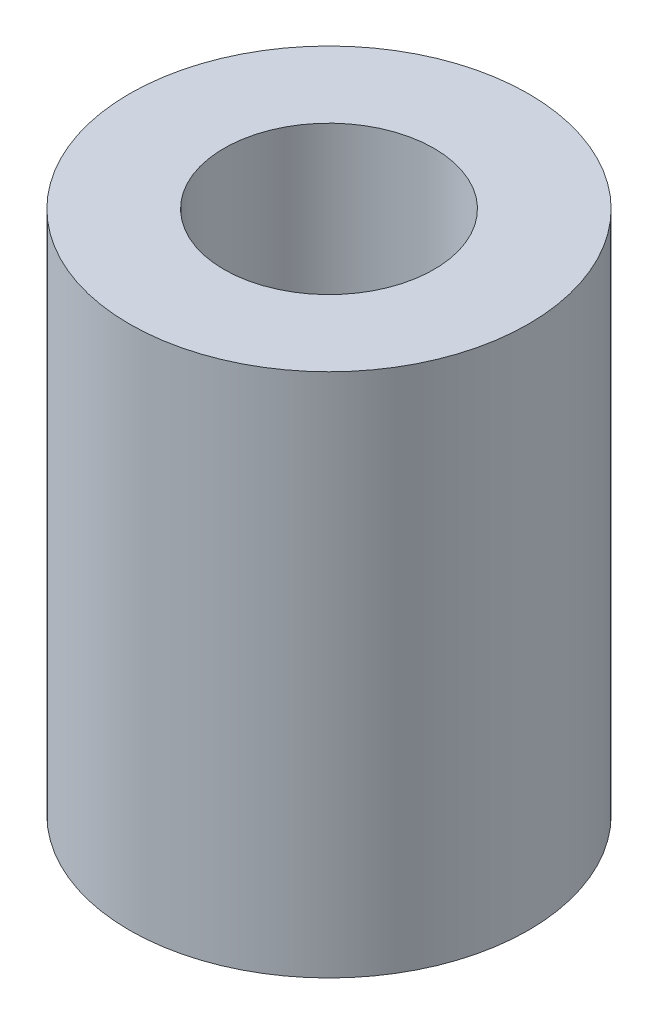
ISO-10303-21;
HEADER;
FILE_DESCRIPTION(('STEP AP214'),'2;1');
FILE_NAME('part.step','',(''),(''),'','','');
FILE_SCHEMA(('AUTOMOTIVE_DESIGN { 1 0 10303 214 1 1 1 1 }'));
ENDSEC;
DATA;
#1=APPLICATION_CONTEXT('core data for automotive mechanical design processes');
#2=APPLICATION_PROTOCOL_DEFINITION('international standard','automotive_design',2000,#1);
#3=PRODUCT_CONTEXT('',#1,'mechanical');
#4=PRODUCT('Part','Part','',(#3));
#5=PRODUCT_RELATED_PRODUCT_CATEGORY('part','',(#4));
#6=PRODUCT_DEFINITION_FORMATION('','',#4);
#7=PRODUCT_DEFINITION_CONTEXT('part definition',#1,'design');
#8=PRODUCT_DEFINITION('design','',#6,#7);
#9=PRODUCT_DEFINITION_SHAPE('','',#8);
#10=(LENGTH_UNIT() NAMED_UNIT(*) SI_UNIT(.MILLI.,.METRE.));
#11=(NAMED_UNIT(*) PLANE_ANGLE_UNIT() SI_UNIT($,.RADIAN.));
#12=(NAMED_UNIT(*) SI_UNIT($,.STERADIAN.) SOLID_ANGLE_UNIT());
#13=UNCERTAINTY_MEASURE_WITH_UNIT(LENGTH_MEASURE(1.E-05),#10,'distance_accuracy_value','');
#14=(GEOMETRIC_REPRESENTATION_CONTEXT(3) GLOBAL_UNCERTAINTY_ASSIGNED_CONTEXT((#13)) GLOBAL_UNIT_ASSIGNED_CONTEXT((#10,
#11,#12)) REPRESENTATION_CONTEXT('',''));
#15=CARTESIAN_POINT('',(0.,0.,0.));
#16=DIRECTION('',(0.,0.,1.));
#17=DIRECTION('',(1.,0.,0.));
#18=AXIS2_PLACEMENT_3D('',#15,#16,#17);
#19=CARTESIAN_POINT('',(0.,25.,0.));
#20=DIRECTION('',(0.,-1.,0.));
#21=DIRECTION('',(0.,0.,-1.));
#22=AXIS2_PLACEMENT_3D('',#19,#20,#21);
#23=CYLINDRICAL_SURFACE('',#22,9.5);
#24=CARTESIAN_POINT('',(0.,25.,0.));
#25=DIRECTION('',(0.,1.,0.));
#26=DIRECTION('',(0.,0.,1.));
#27=AXIS2_PLACEMENT_3D('',#24,#25,#26);
#28=CIRCLE('',#27,9.5);
#29=CARTESIAN_POINT('',(0.,25.,9.5));
#30=VERTEX_POINT('',#29);
#31=EDGE_CURVE('E10',#30,#30,#28,.T.);
#32=ORIENTED_EDGE('',*,*,#31,.F.);
#33=EDGE_LOOP('',(#32));
#34=FACE_BOUND('',#33,.T.);
#35=CARTESIAN_POINT('',(0.,0.,0.));
#36=DIRECTION('',(0.,1.,0.));
#37=DIRECTION('',(0.,0.,1.));
#38=AXIS2_PLACEMENT_3D('',#35,#36,#37);
#39=CIRCLE('',#38,9.5);
#40=CARTESIAN_POINT('',(0.,0.,9.5));
#41=VERTEX_POINT('',#40);
#42=EDGE_CURVE('E40',#41,#41,#39,.T.);
#43=ORIENTED_EDGE('',*,*,#42,.T.);
#44=EDGE_LOOP('',(#43));
#45=FACE_BOUND('',#44,.T.);
#46=ADVANCED_FACE('F37',(#34,#45),#23,.T.);
#47=CARTESIAN_POINT('',(0.,25.,0.));
#48=DIRECTION('',(0.,1.,0.));
#49=DIRECTION('',(0.,0.,1.));
#50=AXIS2_PLACEMENT_3D('',#47,#48,#49);
#51=PLANE('',#50);
#52=CARTESIAN_POINT('',(0.,25.,0.));
#53=DIRECTION('',(0.,1.,0.));
#54=DIRECTION('',(0.,0.,1.));
#55=AXIS2_PLACEMENT_3D('',#52,#53,#54);
#56=CIRCLE('',#55,5.);
#57=CARTESIAN_POINT('',(0.,25.,5.));
#58=VERTEX_POINT('',#57);
#59=EDGE_CURVE('E51',#58,#58,#56,.T.);
#60=ORIENTED_EDGE('',*,*,#59,.F.);
#61=EDGE_LOOP('',(#60));
#62=FACE_BOUND('',#61,.T.);
#63=ORIENTED_EDGE('',*,*,#31,.T.);
#64=EDGE_LOOP('',(#63));
#65=FACE_BOUND('',#64,.T.);
#66=ADVANCED_FACE('F88',(#62,#65),#51,.T.);
#67=CARTESIAN_POINT('',(0.,0.,0.));
#68=DIRECTION('',(0.,1.,0.));
#69=DIRECTION('',(0.,0.,1.));
#70=AXIS2_PLACEMENT_3D('',#67,#68,#69);
#71=PLANE('',#70);
#72=CARTESIAN_POINT('',(0.,0.,0.));
#73=DIRECTION('',(0.,1.,0.));
#74=DIRECTION('',(0.,0.,1.));
#75=AXIS2_PLACEMENT_3D('',#72,#73,#74);
#76=CIRCLE('',#75,4.);
#77=CARTESIAN_POINT('',(0.,0.,4.));
#78=VERTEX_POINT('',#77);
#79=EDGE_CURVE('E55',#78,#78,#76,.T.);
#80=ORIENTED_EDGE('',*,*,#79,.T.);
#81=EDGE_LOOP('',(#80));
#82=FACE_BOUND('',#81,.T.);
#83=ORIENTED_EDGE('',*,*,#42,.F.);
#84=EDGE_LOOP('',(#83));
#85=FACE_BOUND('',#84,.T.);
#86=ADVANCED_FACE('F67',(#82,#85),#71,.F.);
#87=CARTESIAN_POINT('',(0.,7.5,0.));
#88=DIRECTION('',(0.,1.,0.));
#89=DIRECTION('',(0.,0.,1.));
#90=AXIS2_PLACEMENT_3D('',#87,#88,#89);
#91=CYLINDRICAL_SURFACE('',#90,5.);
#92=CARTESIAN_POINT('',(0.,7.5,0.));
#93=DIRECTION('',(0.,1.,0.));
#94=DIRECTION('',(0.,0.,1.));
#95=AXIS2_PLACEMENT_3D('',#92,#93,#94);
#96=CIRCLE('',#95,5.);
#97=CARTESIAN_POINT('',(0.,7.5,5.));
#98=VERTEX_POINT('',#97);
#99=EDGE_CURVE('E49',#98,#98,#96,.T.);
#100=ORIENTED_EDGE('',*,*,#99,.F.);
#101=EDGE_LOOP('',(#100));
#102=FACE_BOUND('',#101,.T.);
#103=ORIENTED_EDGE('',*,*,#59,.T.);
#104=EDGE_LOOP('',(#103));
#105=FACE_BOUND('',#104,.T.);
#106=ADVANCED_FACE('F79',(#102,#105),#91,.F.);
#107=CARTESIAN_POINT('',(0.,7.5,0.));
#108=DIRECTION('',(0.,1.,0.));
#109=DIRECTION('',(0.,0.,1.));
#110=AXIS2_PLACEMENT_3D('',#107,#108,#109);
#111=PLANE('',#110);
#112=CARTESIAN_POINT('',(0.,7.5,0.));
#113=DIRECTION('',(0.,1.,0.));
#114=DIRECTION('',(0.,0.,1.));
#115=AXIS2_PLACEMENT_3D('',#112,#113,#114);
#116=CIRCLE('',#115,4.);
#117=CARTESIAN_POINT('',(0.,7.5,4.));
#118=VERTEX_POINT('',#117);
#119=EDGE_CURVE('E59',#118,#118,#116,.T.);
#120=ORIENTED_EDGE('',*,*,#119,.F.);
#121=EDGE_LOOP('',(#120));
#122=FACE_BOUND('',#121,.T.);
#123=ORIENTED_EDGE('',*,*,#99,.T.);
#124=EDGE_LOOP('',(#123));
#125=FACE_BOUND('',#124,.T.);
#126=ADVANCED_FACE('F73',(#122,#125),#111,.T.);
#127=CARTESIAN_POINT('',(0.,0.,0.));
#128=DIRECTION('',(0.,1.,0.));
#129=DIRECTION('',(0.,0.,1.));
#130=AXIS2_PLACEMENT_3D('',#127,#128,#129);
#131=CYLINDRICAL_SURFACE('',#130,4.);
#132=ORIENTED_EDGE('',*,*,#79,.F.);
#133=EDGE_LOOP('',(#132));
#134=FACE_BOUND('',#133,.T.);
#135=ORIENTED_EDGE('',*,*,#119,.T.);
#136=EDGE_LOOP('',(#135));
#137=FACE_BOUND('',#136,.T.);
#138=ADVANCED_FACE('F70',(#134,#137),#131,.F.);
#139=CLOSED_SHELL('',(#46,#66,#86,#106,#126,#138));
#140=MANIFOLD_SOLID_BREP('B2',#139);
#141=ADVANCED_BREP_SHAPE_REPRESENTATION('',(#18,#140),#14);
#142=SHAPE_DEFINITION_REPRESENTATION(#9,#141);
ENDSEC;
END-ISO-10303-21;
